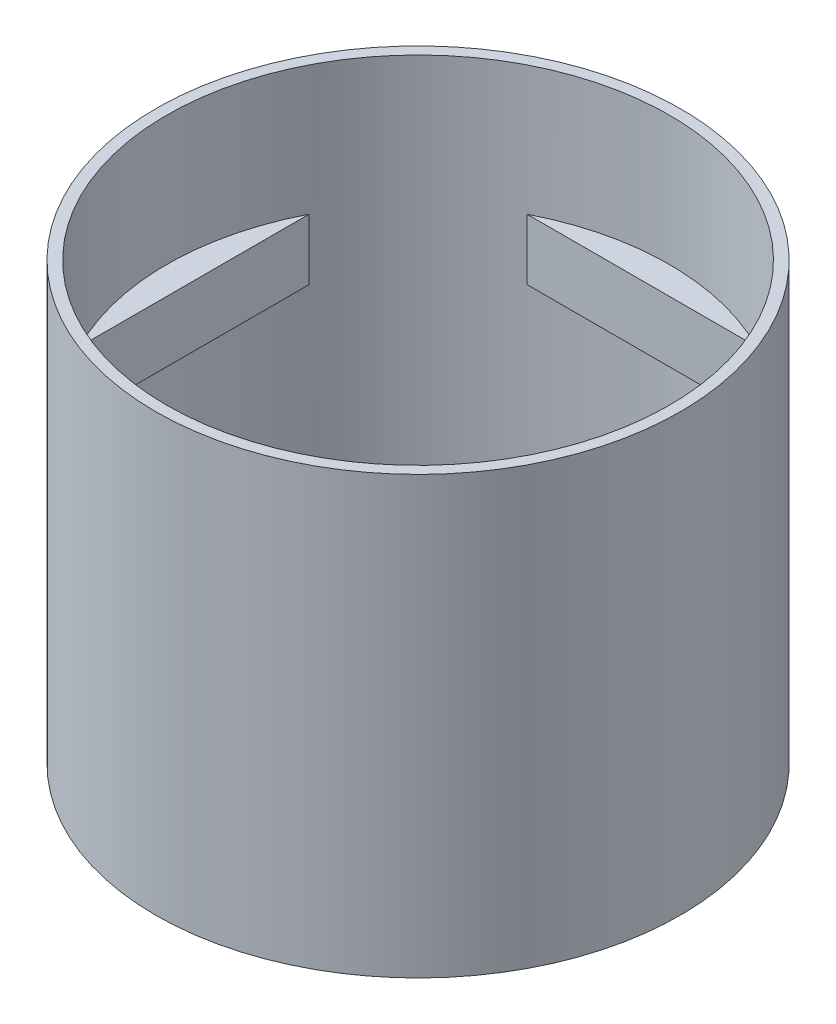
ISO-10303-21;
HEADER;
FILE_DESCRIPTION(('STEP AP214'),'2;1');
FILE_NAME('part.step','',(''),(''),'','','');
FILE_SCHEMA(('AUTOMOTIVE_DESIGN { 1 0 10303 214 1 1 1 1 }'));
ENDSEC;
DATA;
#1=APPLICATION_CONTEXT('core data for automotive mechanical design processes');
#2=APPLICATION_PROTOCOL_DEFINITION('international standard','automotive_design',2000,#1);
#3=PRODUCT_CONTEXT('',#1,'mechanical');
#4=PRODUCT('Part','Part','',(#3));
#5=PRODUCT_RELATED_PRODUCT_CATEGORY('part','',(#4));
#6=PRODUCT_DEFINITION_FORMATION('','',#4);
#7=PRODUCT_DEFINITION_CONTEXT('part definition',#1,'design');
#8=PRODUCT_DEFINITION('design','',#6,#7);
#9=PRODUCT_DEFINITION_SHAPE('','',#8);
#10=(LENGTH_UNIT() NAMED_UNIT(*) SI_UNIT(.MILLI.,.METRE.));
#11=(NAMED_UNIT(*) PLANE_ANGLE_UNIT() SI_UNIT($,.RADIAN.));
#12=(NAMED_UNIT(*) SI_UNIT($,.STERADIAN.) SOLID_ANGLE_UNIT());
#13=UNCERTAINTY_MEASURE_WITH_UNIT(LENGTH_MEASURE(1.E-05),#10,'distance_accuracy_value','');
#14=(GEOMETRIC_REPRESENTATION_CONTEXT(3) GLOBAL_UNCERTAINTY_ASSIGNED_CONTEXT((#13)) GLOBAL_UNIT_ASSIGNED_CONTEXT((#10,
#11,#12)) REPRESENTATION_CONTEXT('',''));
#15=CARTESIAN_POINT('',(0.,0.,0.));
#16=DIRECTION('',(0.,0.,1.));
#17=DIRECTION('',(1.,0.,0.));
#18=AXIS2_PLACEMENT_3D('',#15,#16,#17);
#19=CARTESIAN_POINT('',(0.,118.,0.));
#20=DIRECTION('',(0.,-1.,0.));
#21=DIRECTION('',(0.,0.,-1.));
#22=AXIS2_PLACEMENT_3D('',#19,#20,#21);
#23=CYLINDRICAL_SURFACE('',#22,68.);
#24=CARTESIAN_POINT('',(0.,83.,0.));
#25=DIRECTION('',(0.,1.,0.));
#26=DIRECTION('',(0.,0.,1.));
#27=AXIS2_PLACEMENT_3D('',#24,#25,#26);
#28=CIRCLE('',#27,68.);
#29=CARTESIAN_POINT('',(60.519057707828,83.,31.0071548865191));
#30=VERTEX_POINT('',#29);
#31=CARTESIAN_POINT('',(60.5190577078285,83.,-31.0071548865181));
#32=VERTEX_POINT('',#31);
#33=EDGE_CURVE('E104',#30,#32,#28,.T.);
#34=ORIENTED_EDGE('',*,*,#33,.F.);
#35=DIRECTION('',(0.,-1.,0.));
#36=VECTOR('',#35,1.);
#37=CARTESIAN_POINT('',(60.519057707828,83.,31.0071548865191));
#38=LINE('',#37,#36);
#39=CARTESIAN_POINT('',(60.519057707828,66.5,31.0071548865191));
#40=VERTEX_POINT('',#39);
#41=EDGE_CURVE('E110',#30,#40,#38,.T.);
#42=ORIENTED_EDGE('',*,*,#41,.T.);
#43=CARTESIAN_POINT('',(0.,66.5,0.));
#44=DIRECTION('',(0.,1.,0.));
#45=DIRECTION('',(0.,0.,1.));
#46=AXIS2_PLACEMENT_3D('',#43,#44,#45);
#47=CIRCLE('',#46,68.);
#48=CARTESIAN_POINT('',(60.5190577078285,66.5,-31.0071548865182));
#49=VERTEX_POINT('',#48);
#50=EDGE_CURVE('E107',#40,#49,#47,.T.);
#51=ORIENTED_EDGE('',*,*,#50,.T.);
#52=DIRECTION('',(0.,-1.,0.));
#53=VECTOR('',#52,1.);
#54=CARTESIAN_POINT('',(60.5190577078285,83.,-31.0071548865181));
#55=LINE('',#54,#53);
#56=EDGE_CURVE('E114',#32,#49,#55,.T.);
#57=ORIENTED_EDGE('',*,*,#56,.F.);
#58=EDGE_LOOP('',(#34,#42,#51,#57));
#59=FACE_BOUND('',#58,.T.);
#60=CARTESIAN_POINT('',(0.,83.,0.));
#61=DIRECTION('',(0.,1.,0.));
#62=DIRECTION('',(0.,0.,1.));
#63=AXIS2_PLACEMENT_3D('',#60,#61,#62);
#64=CIRCLE('',#63,68.);
#65=CARTESIAN_POINT('',(-60.5190577078282,83.,-31.0071548865187));
#66=VERTEX_POINT('',#65);
#67=CARTESIAN_POINT('',(-60.5190577078282,83.,31.0071548865187));
#68=VERTEX_POINT('',#67);
#69=EDGE_CURVE('E124',#66,#68,#64,.T.);
#70=ORIENTED_EDGE('',*,*,#69,.F.);
#71=DIRECTION('',(0.,-1.,0.));
#72=VECTOR('',#71,1.);
#73=CARTESIAN_POINT('',(-60.5190577078282,83.,-31.0071548865187));
#74=LINE('',#73,#72);
#75=CARTESIAN_POINT('',(-60.5190577078282,66.5,-31.0071548865187));
#76=VERTEX_POINT('',#75);
#77=EDGE_CURVE('E132',#66,#76,#74,.T.);
#78=ORIENTED_EDGE('',*,*,#77,.T.);
#79=CARTESIAN_POINT('',(0.,66.5,0.));
#80=DIRECTION('',(0.,1.,0.));
#81=DIRECTION('',(0.,0.,1.));
#82=AXIS2_PLACEMENT_3D('',#79,#80,#81);
#83=CIRCLE('',#82,68.);
#84=CARTESIAN_POINT('',(-60.5190577078282,66.5,31.0071548865186));
#85=VERTEX_POINT('',#84);
#86=EDGE_CURVE('E125',#76,#85,#83,.T.);
#87=ORIENTED_EDGE('',*,*,#86,.T.);
#88=DIRECTION('',(0.,-1.,0.));
#89=VECTOR('',#88,1.);
#90=CARTESIAN_POINT('',(-60.5190577078282,83.,31.0071548865187));
#91=LINE('',#90,#89);
#92=EDGE_CURVE('E127',#68,#85,#91,.T.);
#93=ORIENTED_EDGE('',*,*,#92,.F.);
#94=EDGE_LOOP('',(#70,#78,#87,#93));
#95=FACE_BOUND('',#94,.T.);
#96=CARTESIAN_POINT('',(0.,83.,0.));
#97=DIRECTION('',(0.,1.,0.));
#98=DIRECTION('',(0.,0.,1.));
#99=AXIS2_PLACEMENT_3D('',#96,#97,#98);
#100=CIRCLE('',#99,68.);
#101=CARTESIAN_POINT('',(31.0071548865189,83.,-60.5190577078281));
#102=VERTEX_POINT('',#101);
#103=CARTESIAN_POINT('',(-31.0071548865185,83.,-60.5190577078283));
#104=VERTEX_POINT('',#103);
#105=EDGE_CURVE('E138',#102,#104,#100,.T.);
#106=ORIENTED_EDGE('',*,*,#105,.F.);
#107=DIRECTION('',(0.,-1.,0.));
#108=VECTOR('',#107,1.);
#109=CARTESIAN_POINT('',(31.0071548865189,83.,-60.5190577078281));
#110=LINE('',#109,#108);
#111=CARTESIAN_POINT('',(31.0071548865189,66.5,-60.5190577078281));
#112=VERTEX_POINT('',#111);
#113=EDGE_CURVE('E148',#102,#112,#110,.T.);
#114=ORIENTED_EDGE('',*,*,#113,.T.);
#115=CARTESIAN_POINT('',(0.,66.5,0.));
#116=DIRECTION('',(0.,1.,0.));
#117=DIRECTION('',(0.,0.,1.));
#118=AXIS2_PLACEMENT_3D('',#115,#116,#117);
#119=CIRCLE('',#118,68.);
#120=CARTESIAN_POINT('',(-31.0071548865184,66.5,-60.5190577078283));
#121=VERTEX_POINT('',#120);
#122=EDGE_CURVE('E139',#112,#121,#119,.T.);
#123=ORIENTED_EDGE('',*,*,#122,.T.);
#124=DIRECTION('',(0.,-1.,0.));
#125=VECTOR('',#124,1.);
#126=CARTESIAN_POINT('',(-31.0071548865185,83.,-60.5190577078283));
#127=LINE('',#126,#125);
#128=EDGE_CURVE('E141',#104,#121,#127,.T.);
#129=ORIENTED_EDGE('',*,*,#128,.F.);
#130=EDGE_LOOP('',(#106,#114,#123,#129));
#131=FACE_BOUND('',#130,.T.);
#132=CARTESIAN_POINT('',(0.,83.,0.));
#133=DIRECTION('',(0.,1.,0.));
#134=DIRECTION('',(0.,0.,1.));
#135=AXIS2_PLACEMENT_3D('',#132,#133,#134);
#136=CIRCLE('',#135,68.);
#137=CARTESIAN_POINT('',(-31.0071548865193,83.,60.5190577078279));
#138=VERTEX_POINT('',#137);
#139=CARTESIAN_POINT('',(31.0071548865181,83.,60.5190577078285));
#140=VERTEX_POINT('',#139);
#141=EDGE_CURVE('E154',#138,#140,#136,.T.);
#142=ORIENTED_EDGE('',*,*,#141,.F.);
#143=DIRECTION('',(0.,-1.,0.));
#144=VECTOR('',#143,1.);
#145=CARTESIAN_POINT('',(-31.0071548865193,83.,60.5190577078279));
#146=LINE('',#145,#144);
#147=CARTESIAN_POINT('',(-31.0071548865193,66.5,60.5190577078279));
#148=VERTEX_POINT('',#147);
#149=EDGE_CURVE('E164',#138,#148,#146,.T.);
#150=ORIENTED_EDGE('',*,*,#149,.T.);
#151=CARTESIAN_POINT('',(0.,66.5,0.));
#152=DIRECTION('',(0.,1.,0.));
#153=DIRECTION('',(0.,0.,1.));
#154=AXIS2_PLACEMENT_3D('',#151,#152,#153);
#155=CIRCLE('',#154,68.);
#156=CARTESIAN_POINT('',(31.007154886518,66.5,60.5190577078285));
#157=VERTEX_POINT('',#156);
#158=EDGE_CURVE('E155',#148,#157,#155,.T.);
#159=ORIENTED_EDGE('',*,*,#158,.T.);
#160=DIRECTION('',(0.,-1.,0.));
#161=VECTOR('',#160,1.);
#162=CARTESIAN_POINT('',(31.0071548865181,83.,60.5190577078285));
#163=LINE('',#162,#161);
#164=EDGE_CURVE('E157',#140,#157,#163,.T.);
#165=ORIENTED_EDGE('',*,*,#164,.F.);
#166=EDGE_LOOP('',(#142,#150,#159,#165));
#167=FACE_BOUND('',#166,.T.);
#168=CARTESIAN_POINT('',(0.,118.,0.));
#169=DIRECTION('',(0.,1.,0.));
#170=DIRECTION('',(0.,0.,1.));
#171=AXIS2_PLACEMENT_3D('',#168,#169,#170);
#172=CIRCLE('',#171,68.);
#173=CARTESIAN_POINT('',(0.,118.,68.));
#174=VERTEX_POINT('',#173);
#175=EDGE_CURVE('E43',#174,#174,#172,.T.);
#176=ORIENTED_EDGE('',*,*,#175,.T.);
#177=EDGE_LOOP('',(#176));
#178=FACE_BOUND('',#177,.T.);
#179=CARTESIAN_POINT('',(0.,0.,0.));
#180=DIRECTION('',(0.,1.,0.));
#181=DIRECTION('',(0.,0.,1.));
#182=AXIS2_PLACEMENT_3D('',#179,#180,#181);
#183=CIRCLE('',#182,68.);
#184=CARTESIAN_POINT('',(0.,0.,68.));
#185=VERTEX_POINT('',#184);
#186=EDGE_CURVE('E167',#185,#185,#183,.T.);
#187=ORIENTED_EDGE('',*,*,#186,.F.);
#188=EDGE_LOOP('',(#187));
#189=FACE_BOUND('',#188,.T.);
#190=ADVANCED_FACE('F35',(#59,#95,#131,#167,#178,#189),#23,.F.);
#191=CARTESIAN_POINT('',(0.,118.,0.));
#192=DIRECTION('',(0.,-1.,0.));
#193=DIRECTION('',(0.,0.,-1.));
#194=AXIS2_PLACEMENT_3D('',#191,#192,#193);
#195=CYLINDRICAL_SURFACE('',#194,71.);
#196=CARTESIAN_POINT('',(0.,118.,0.));
#197=DIRECTION('',(0.,1.,0.));
#198=DIRECTION('',(0.,0.,1.));
#199=AXIS2_PLACEMENT_3D('',#196,#197,#198);
#200=CIRCLE('',#199,71.);
#201=CARTESIAN_POINT('',(0.,118.,71.));
#202=VERTEX_POINT('',#201);
#203=EDGE_CURVE('E11',#202,#202,#200,.T.);
#204=ORIENTED_EDGE('',*,*,#203,.F.);
#205=EDGE_LOOP('',(#204));
#206=FACE_BOUND('',#205,.T.);
#207=CARTESIAN_POINT('',(0.,0.,0.));
#208=DIRECTION('',(0.,1.,0.));
#209=DIRECTION('',(0.,0.,1.));
#210=AXIS2_PLACEMENT_3D('',#207,#208,#209);
#211=CIRCLE('',#210,71.);
#212=CARTESIAN_POINT('',(0.,0.,71.));
#213=VERTEX_POINT('',#212);
#214=EDGE_CURVE('E38',#213,#213,#211,.T.);
#215=ORIENTED_EDGE('',*,*,#214,.T.);
#216=EDGE_LOOP('',(#215));
#217=FACE_BOUND('',#216,.T.);
#218=ADVANCED_FACE('F175',(#206,#217),#195,.T.);
#219=CARTESIAN_POINT('',(0.,118.,0.));
#220=DIRECTION('',(0.,1.,0.));
#221=DIRECTION('',(0.,0.,1.));
#222=AXIS2_PLACEMENT_3D('',#219,#220,#221);
#223=PLANE('',#222);
#224=ORIENTED_EDGE('',*,*,#175,.F.);
#225=EDGE_LOOP('',(#224));
#226=FACE_BOUND('',#225,.T.);
#227=ORIENTED_EDGE('',*,*,#203,.T.);
#228=EDGE_LOOP('',(#227));
#229=FACE_BOUND('',#228,.T.);
#230=ADVANCED_FACE('F180',(#226,#229),#223,.T.);
#231=CARTESIAN_POINT('',(0.,0.,0.));
#232=DIRECTION('',(0.,1.,0.));
#233=DIRECTION('',(0.,0.,1.));
#234=AXIS2_PLACEMENT_3D('',#231,#232,#233);
#235=PLANE('',#234);
#236=ORIENTED_EDGE('',*,*,#186,.T.);
#237=EDGE_LOOP('',(#236));
#238=FACE_BOUND('',#237,.T.);
#239=ORIENTED_EDGE('',*,*,#214,.F.);
#240=EDGE_LOOP('',(#239));
#241=FACE_BOUND('',#240,.T.);
#242=ADVANCED_FACE('F177',(#238,#241),#235,.F.);
#243=CARTESIAN_POINT('',(-6.82757002781996E-13,83.,60.5190577078282));
#244=DIRECTION('',(0.,0.,1.));
#245=DIRECTION('',(1.,0.,0.));
#246=AXIS2_PLACEMENT_3D('',#243,#244,#245);
#247=PLANE('',#246);
#248=DIRECTION('',(-1.,0.,0.));
#249=VECTOR('',#248,1.);
#250=CARTESIAN_POINT('',(-6.82757002781996E-13,66.5,60.5190577078282));
#251=LINE('',#250,#249);
#252=EDGE_CURVE('E151',#157,#148,#251,.T.);
#253=ORIENTED_EDGE('',*,*,#252,.T.);
#254=ORIENTED_EDGE('',*,*,#149,.F.);
#255=DIRECTION('',(-1.,0.,0.));
#256=VECTOR('',#255,1.);
#257=CARTESIAN_POINT('',(-6.82757002781996E-13,83.,60.5190577078282));
#258=LINE('',#257,#256);
#259=EDGE_CURVE('E152',#140,#138,#258,.T.);
#260=ORIENTED_EDGE('',*,*,#259,.F.);
#261=ORIENTED_EDGE('',*,*,#164,.T.);
#262=EDGE_LOOP('',(#253,#254,#260,#261));
#263=FACE_BOUND('',#262,.T.);
#264=ADVANCED_FACE('F179',(#263),#247,.F.);
#265=CARTESIAN_POINT('',(0.,83.,0.));
#266=DIRECTION('',(0.,1.,0.));
#267=DIRECTION('',(0.,0.,1.));
#268=AXIS2_PLACEMENT_3D('',#265,#266,#267);
#269=PLANE('',#268);
#270=ORIENTED_EDGE('',*,*,#259,.T.);
#271=ORIENTED_EDGE('',*,*,#141,.T.);
#272=EDGE_LOOP('',(#270,#271));
#273=FACE_BOUND('',#272,.T.);
#274=ADVANCED_FACE('F186',(#273),#269,.T.);
#275=CARTESIAN_POINT('',(0.,66.5,0.));
#276=DIRECTION('',(0.,1.,0.));
#277=DIRECTION('',(0.,0.,1.));
#278=AXIS2_PLACEMENT_3D('',#275,#276,#277);
#279=PLANE('',#278);
#280=ORIENTED_EDGE('',*,*,#252,.F.);
#281=ORIENTED_EDGE('',*,*,#158,.F.);
#282=EDGE_LOOP('',(#280,#281));
#283=FACE_BOUND('',#282,.T.);
#284=ADVANCED_FACE('F229',(#283),#279,.F.);
#285=CARTESIAN_POINT('',(2.58340487539134E-13,83.,-60.5190577078282));
#286=DIRECTION('',(0.,0.,-1.));
#287=DIRECTION('',(-1.,0.,0.));
#288=AXIS2_PLACEMENT_3D('',#285,#286,#287);
#289=PLANE('',#288);
#290=DIRECTION('',(1.,0.,0.));
#291=VECTOR('',#290,1.);
#292=CARTESIAN_POINT('',(2.58340487539134E-13,66.5,-60.5190577078282));
#293=LINE('',#292,#291);
#294=EDGE_CURVE('E135',#121,#112,#293,.T.);
#295=ORIENTED_EDGE('',*,*,#294,.T.);
#296=ORIENTED_EDGE('',*,*,#113,.F.);
#297=DIRECTION('',(1.,0.,0.));
#298=VECTOR('',#297,1.);
#299=CARTESIAN_POINT('',(2.58340487539134E-13,83.,-60.5190577078282));
#300=LINE('',#299,#298);
#301=EDGE_CURVE('E136',#104,#102,#300,.T.);
#302=ORIENTED_EDGE('',*,*,#301,.F.);
#303=ORIENTED_EDGE('',*,*,#128,.T.);
#304=EDGE_LOOP('',(#295,#296,#302,#303));
#305=FACE_BOUND('',#304,.T.);
#306=ADVANCED_FACE('F239',(#305),#289,.F.);
#307=CARTESIAN_POINT('',(0.,83.,0.));
#308=DIRECTION('',(0.,1.,0.));
#309=DIRECTION('',(0.,0.,1.));
#310=AXIS2_PLACEMENT_3D('',#307,#308,#309);
#311=PLANE('',#310);
#312=ORIENTED_EDGE('',*,*,#301,.T.);
#313=ORIENTED_EDGE('',*,*,#105,.T.);
#314=EDGE_LOOP('',(#312,#313));
#315=FACE_BOUND('',#314,.T.);
#316=ADVANCED_FACE('F250',(#315),#311,.T.);
#317=CARTESIAN_POINT('',(0.,66.5,0.));
#318=DIRECTION('',(0.,1.,0.));
#319=DIRECTION('',(0.,0.,1.));
#320=AXIS2_PLACEMENT_3D('',#317,#318,#319);
#321=PLANE('',#320);
#322=ORIENTED_EDGE('',*,*,#294,.F.);
#323=ORIENTED_EDGE('',*,*,#122,.F.);
#324=EDGE_LOOP('',(#322,#323));
#325=FACE_BOUND('',#324,.T.);
#326=ADVANCED_FACE('F261',(#325),#321,.F.);
#327=CARTESIAN_POINT('',(-60.5190577078282,83.,0.));
#328=DIRECTION('',(-1.,0.,0.));
#329=DIRECTION('',(0.,0.,1.));
#330=AXIS2_PLACEMENT_3D('',#327,#328,#329);
#331=PLANE('',#330);
#332=DIRECTION('',(0.,0.,-1.));
#333=VECTOR('',#332,1.);
#334=CARTESIAN_POINT('',(-60.5190577078282,66.5,0.));
#335=LINE('',#334,#333);
#336=EDGE_CURVE('E57',#85,#76,#335,.T.);
#337=ORIENTED_EDGE('',*,*,#336,.T.);
#338=ORIENTED_EDGE('',*,*,#77,.F.);
#339=DIRECTION('',(0.,0.,-1.));
#340=VECTOR('',#339,1.);
#341=CARTESIAN_POINT('',(-60.5190577078282,83.,0.));
#342=LINE('',#341,#340);
#343=EDGE_CURVE('E122',#68,#66,#342,.T.);
#344=ORIENTED_EDGE('',*,*,#343,.F.);
#345=ORIENTED_EDGE('',*,*,#92,.T.);
#346=EDGE_LOOP('',(#337,#338,#344,#345));
#347=FACE_BOUND('',#346,.T.);
#348=ADVANCED_FACE('F271',(#347),#331,.F.);
#349=CARTESIAN_POINT('',(0.,83.,0.));
#350=DIRECTION('',(0.,1.,0.));
#351=DIRECTION('',(0.,0.,1.));
#352=AXIS2_PLACEMENT_3D('',#349,#350,#351);
#353=PLANE('',#352);
#354=ORIENTED_EDGE('',*,*,#343,.T.);
#355=ORIENTED_EDGE('',*,*,#69,.T.);
#356=EDGE_LOOP('',(#354,#355));
#357=FACE_BOUND('',#356,.T.);
#358=ADVANCED_FACE('F282',(#357),#353,.T.);
#359=CARTESIAN_POINT('',(0.,66.5,0.));
#360=DIRECTION('',(0.,1.,0.));
#361=DIRECTION('',(0.,0.,1.));
#362=AXIS2_PLACEMENT_3D('',#359,#360,#361);
#363=PLANE('',#362);
#364=ORIENTED_EDGE('',*,*,#336,.F.);
#365=ORIENTED_EDGE('',*,*,#86,.F.);
#366=EDGE_LOOP('',(#364,#365));
#367=FACE_BOUND('',#366,.T.);
#368=ADVANCED_FACE('F293',(#367),#363,.F.);
#369=CARTESIAN_POINT('',(60.5190577078282,83.,4.61322299177025E-13));
#370=DIRECTION('',(1.,0.,0.));
#371=DIRECTION('',(0.,0.,-1.));
#372=AXIS2_PLACEMENT_3D('',#369,#370,#371);
#373=PLANE('',#372);
#374=DIRECTION('',(0.,0.,1.));
#375=VECTOR('',#374,1.);
#376=CARTESIAN_POINT('',(60.5190577078282,66.5,4.61322299177025E-13));
#377=LINE('',#376,#375);
#378=EDGE_CURVE('E50',#49,#40,#377,.T.);
#379=ORIENTED_EDGE('',*,*,#378,.T.);
#380=ORIENTED_EDGE('',*,*,#41,.F.);
#381=DIRECTION('',(0.,0.,1.));
#382=VECTOR('',#381,1.);
#383=CARTESIAN_POINT('',(60.5190577078282,83.,4.61322299177025E-13));
#384=LINE('',#383,#382);
#385=EDGE_CURVE('E100',#32,#30,#384,.T.);
#386=ORIENTED_EDGE('',*,*,#385,.F.);
#387=ORIENTED_EDGE('',*,*,#56,.T.);
#388=EDGE_LOOP('',(#379,#380,#386,#387));
#389=FACE_BOUND('',#388,.T.);
#390=ADVANCED_FACE('F111',(#389),#373,.F.);
#391=CARTESIAN_POINT('',(0.,83.,0.));
#392=DIRECTION('',(0.,1.,0.));
#393=DIRECTION('',(0.,0.,1.));
#394=AXIS2_PLACEMENT_3D('',#391,#392,#393);
#395=PLANE('',#394);
#396=ORIENTED_EDGE('',*,*,#385,.T.);
#397=ORIENTED_EDGE('',*,*,#33,.T.);
#398=EDGE_LOOP('',(#396,#397));
#399=FACE_BOUND('',#398,.T.);
#400=ADVANCED_FACE('F102',(#399),#395,.T.);
#401=CARTESIAN_POINT('',(0.,66.5,0.));
#402=DIRECTION('',(0.,1.,0.));
#403=DIRECTION('',(0.,0.,1.));
#404=AXIS2_PLACEMENT_3D('',#401,#402,#403);
#405=PLANE('',#404);
#406=ORIENTED_EDGE('',*,*,#378,.F.);
#407=ORIENTED_EDGE('',*,*,#50,.F.);
#408=EDGE_LOOP('',(#406,#407));
#409=FACE_BOUND('',#408,.T.);
#410=ADVANCED_FACE('F321',(#409),#405,.F.);
#411=CLOSED_SHELL('',(#190,#218,#230,#242,#264,#274,#284,#306,#316,#326,#348,#358,#368,#390,
#400,#410));
#412=MANIFOLD_SOLID_BREP('B2',#411);
#413=ADVANCED_BREP_SHAPE_REPRESENTATION('',(#18,#412),#14);
#414=SHAPE_DEFINITION_REPRESENTATION(#9,#413);
ENDSEC;
END-ISO-10303-21;
